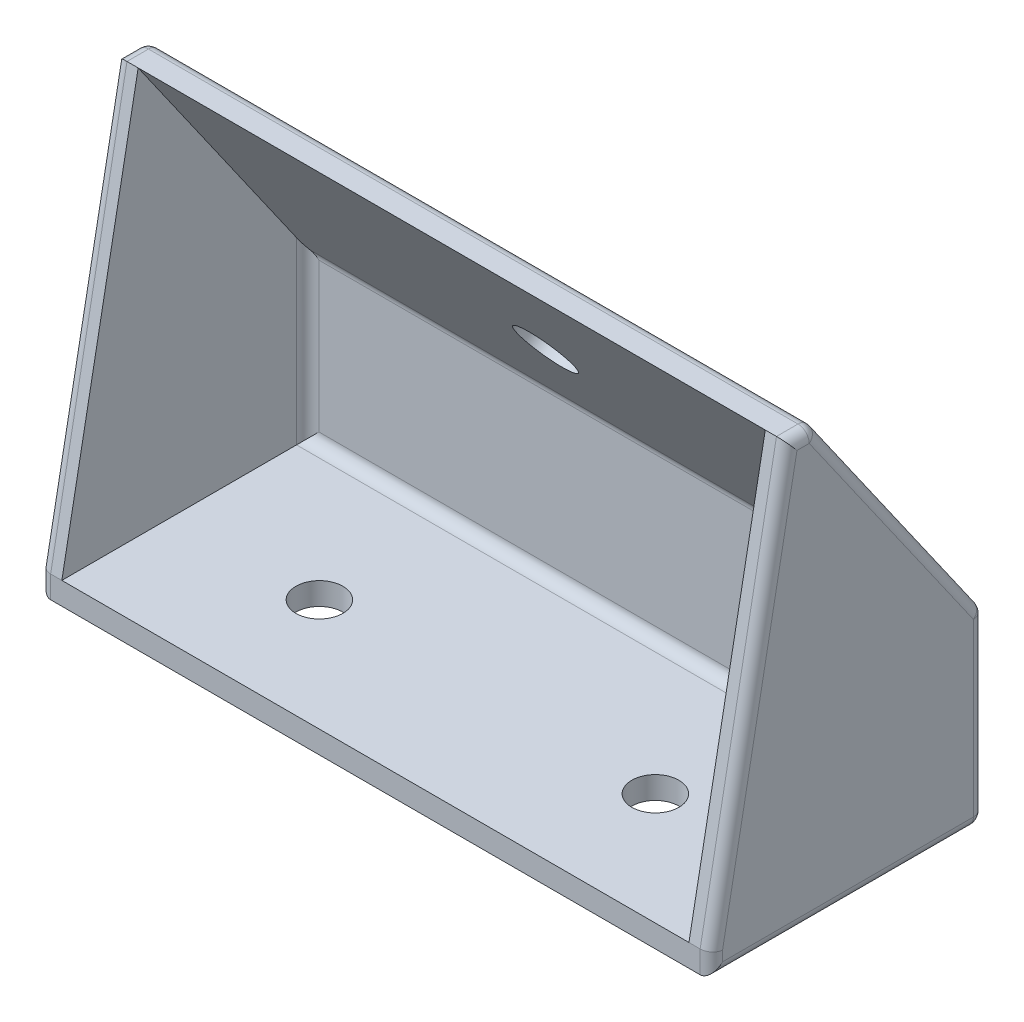
ISO-10303-21;
HEADER;
FILE_DESCRIPTION(('STEP AP214'),'2;1');
FILE_NAME('part.step','',(''),(''),'','','');
FILE_SCHEMA(('AUTOMOTIVE_DESIGN { 1 0 10303 214 1 1 1 1 }'));
ENDSEC;
DATA;
#1=APPLICATION_CONTEXT('core data for automotive mechanical design processes');
#2=APPLICATION_PROTOCOL_DEFINITION('international standard','automotive_design',2000,#1);
#3=PRODUCT_CONTEXT('',#1,'mechanical');
#4=PRODUCT('Part','Part','',(#3));
#5=PRODUCT_RELATED_PRODUCT_CATEGORY('part','',(#4));
#6=PRODUCT_DEFINITION_FORMATION('','',#4);
#7=PRODUCT_DEFINITION_CONTEXT('part definition',#1,'design');
#8=PRODUCT_DEFINITION('design','',#6,#7);
#9=PRODUCT_DEFINITION_SHAPE('','',#8);
#10=(LENGTH_UNIT() NAMED_UNIT(*) SI_UNIT(.MILLI.,.METRE.));
#11=(NAMED_UNIT(*) PLANE_ANGLE_UNIT() SI_UNIT($,.RADIAN.));
#12=(NAMED_UNIT(*) SI_UNIT($,.STERADIAN.) SOLID_ANGLE_UNIT());
#13=UNCERTAINTY_MEASURE_WITH_UNIT(LENGTH_MEASURE(1.E-05),#10,'distance_accuracy_value','');
#14=(GEOMETRIC_REPRESENTATION_CONTEXT(3) GLOBAL_UNCERTAINTY_ASSIGNED_CONTEXT((#13)) GLOBAL_UNIT_ASSIGNED_CONTEXT((#10,
#11,#12)) REPRESENTATION_CONTEXT('',''));
#15=CARTESIAN_POINT('',(0.,0.,0.));
#16=DIRECTION('',(0.,0.,1.));
#17=DIRECTION('',(1.,0.,0.));
#18=AXIS2_PLACEMENT_3D('',#15,#16,#17);
#19=CARTESIAN_POINT('',(-38.1,0.,-30.4272325445459));
#20=DIRECTION('',(0.,0.573576436351044,-0.819152044288993));
#21=DIRECTION('',(0.,0.819152044288993,0.573576436351044));
#22=AXIS2_PLACEMENT_3D('',#19,#20,#21);
#23=PLANE('',#22);
#24=CARTESIAN_POINT('',(0.,12.2753807221291,-21.831918428517));
#25=DIRECTION('',(0.,0.573576436351044,-0.819152044288993));
#26=DIRECTION('',(0.,0.819152044288993,0.573576436351044));
#27=AXIS2_PLACEMENT_3D('',#24,#25,#26);
#28=CIRCLE('',#27,3.25);
#29=CARTESIAN_POINT('',(0.,14.9376248660683,-19.9677950103761));
#30=VERTEX_POINT('',#29);
#31=EDGE_CURVE('E240',#30,#30,#28,.F.);
#32=ORIENTED_EDGE('',*,*,#31,.F.);
#33=EDGE_LOOP('',(#32));
#34=FACE_BOUND('',#33,.T.);
#35=DIRECTION('',(1.,0.,0.));
#36=VECTOR('',#35,1.);
#37=CARTESIAN_POINT('',(35.56,0.32801261228952,-30.1975556407929));
#38=LINE('',#37,#36);
#39=CARTESIAN_POINT('',(-35.0184420741664,0.32801261228952,-30.1975556407929));
#40=VERTEX_POINT('',#39);
#41=CARTESIAN_POINT('',(35.0184420741664,0.32801261228952,-30.1975556407929));
#42=VERTEX_POINT('',#41);
#43=EDGE_CURVE('E265',#40,#42,#38,.T.);
#44=ORIENTED_EDGE('',*,*,#43,.T.);
#45=CARTESIAN_POINT('',(34.29,1.8137479685625,-29.1572325445459));
#46=DIRECTION('',(0.,0.573576436351044,-0.819152044288993));
#47=DIRECTION('',(0.,-0.819152044288993,-0.573576436351044));
#48=AXIS2_PLACEMENT_3D('',#45,#46,#47);
#49=ELLIPSE('',#48,2.2141774304388,1.27);
#50=CARTESIAN_POINT('',(35.56,1.81374796856249,-29.1572325445459));
#51=VERTEX_POINT('',#50);
#52=EDGE_CURVE('E269',#42,#51,#49,.F.);
#53=ORIENTED_EDGE('',*,*,#52,.T.);
#54=DIRECTION('',(0.,0.819152044288993,0.573576436351044));
#55=VECTOR('',#54,1.);
#56=CARTESIAN_POINT('',(35.56,0.,-30.4272325445459));
#57=LINE('',#56,#55);
#58=CARTESIAN_POINT('',(35.56,27.4645297409215,-11.196361786568));
#59=VERTEX_POINT('',#58);
#60=EDGE_CURVE('E231',#51,#59,#57,.T.);
#61=ORIENTED_EDGE('',*,*,#60,.T.);
#62=DIRECTION('',(1.,0.,0.));
#63=VECTOR('',#62,1.);
#64=CARTESIAN_POINT('',(38.1,27.4645297409215,-11.196361786568));
#65=LINE('',#64,#63);
#66=CARTESIAN_POINT('',(-35.56,27.4645297409215,-11.196361786568));
#67=VERTEX_POINT('',#66);
#68=EDGE_CURVE('E195',#67,#59,#65,.T.);
#69=ORIENTED_EDGE('',*,*,#68,.F.);
#70=DIRECTION('',(0.,-0.819152044288993,-0.573576436351044));
#71=VECTOR('',#70,1.);
#72=CARTESIAN_POINT('',(-35.56,27.4645297409215,-11.196361786568));
#73=LINE('',#72,#71);
#74=CARTESIAN_POINT('',(-35.56,1.81374796856248,-29.1572325445459));
#75=VERTEX_POINT('',#74);
#76=EDGE_CURVE('E209',#67,#75,#73,.T.);
#77=ORIENTED_EDGE('',*,*,#76,.T.);
#78=CARTESIAN_POINT('',(-34.29,1.8137479685625,-29.1572325445459));
#79=DIRECTION('',(0.,0.573576436351044,-0.819152044288993));
#80=DIRECTION('',(0.,-0.819152044288993,-0.573576436351044));
#81=AXIS2_PLACEMENT_3D('',#78,#79,#80);
#82=ELLIPSE('',#81,2.2141774304388,1.27);
#83=EDGE_CURVE('E267',#75,#40,#82,.F.);
#84=ORIENTED_EDGE('',*,*,#83,.T.);
#85=EDGE_LOOP('',(#44,#53,#61,#69,#77,#84));
#86=FACE_BOUND('',#85,.T.);
#87=ADVANCED_FACE('F34',(#34,#86),#23,.F.);
#88=CARTESIAN_POINT('',(-38.1,-18.542,-30.4272325445459));
#89=DIRECTION('',(0.,0.,-1.));
#90=DIRECTION('',(-1.,0.,0.));
#91=AXIS2_PLACEMENT_3D('',#88,#89,#90);
#92=PLANE('',#91);
#93=DIRECTION('',(1.,0.,0.));
#94=VECTOR('',#93,1.);
#95=CARTESIAN_POINT('',(35.56,-17.272,-30.4272325445459));
#96=LINE('',#95,#94);
#97=CARTESIAN_POINT('',(-34.29,-17.272,-30.4272325445459));
#98=VERTEX_POINT('',#97);
#99=CARTESIAN_POINT('',(34.29,-17.272,-30.4272325445459));
#100=VERTEX_POINT('',#99);
#101=EDGE_CURVE('E260',#98,#100,#96,.T.);
#102=ORIENTED_EDGE('',*,*,#101,.T.);
#103=DIRECTION('',(0.,1.,0.));
#104=VECTOR('',#103,1.);
#105=CARTESIAN_POINT('',(34.29,0.,-30.4272325445459));
#106=LINE('',#105,#104);
#107=CARTESIAN_POINT('',(34.29,-0.400429461876306,-30.4272325445459));
#108=VERTEX_POINT('',#107);
#109=EDGE_CURVE('E262',#100,#108,#106,.T.);
#110=ORIENTED_EDGE('',*,*,#109,.T.);
#111=DIRECTION('',(1.,0.,0.));
#112=VECTOR('',#111,1.);
#113=CARTESIAN_POINT('',(-35.56,-0.400429461876306,-30.4272325445459));
#114=LINE('',#113,#112);
#115=CARTESIAN_POINT('',(-34.29,-0.400429461876306,-30.4272325445459));
#116=VERTEX_POINT('',#115);
#117=EDGE_CURVE('E256',#108,#116,#114,.F.);
#118=ORIENTED_EDGE('',*,*,#117,.T.);
#119=DIRECTION('',(0.,-1.,0.));
#120=VECTOR('',#119,1.);
#121=CARTESIAN_POINT('',(-34.29,-18.542,-30.4272325445459));
#122=LINE('',#121,#120);
#123=EDGE_CURVE('E258',#116,#98,#122,.T.);
#124=ORIENTED_EDGE('',*,*,#123,.T.);
#125=EDGE_LOOP('',(#102,#110,#118,#124));
#126=FACE_BOUND('',#125,.T.);
#127=ADVANCED_FACE('F519',(#126),#92,.F.);
#128=CARTESIAN_POINT('',(-38.1,-18.542,-2.54));
#129=DIRECTION('',(0.,-1.,0.));
#130=DIRECTION('',(0.,0.,-1.));
#131=AXIS2_PLACEMENT_3D('',#128,#129,#130);
#132=PLANE('',#131);
#133=CARTESIAN_POINT('',(19.05,-18.542,-15.24));
#134=DIRECTION('',(0.,1.,0.));
#135=DIRECTION('',(0.,0.,1.));
#136=AXIS2_PLACEMENT_3D('',#133,#134,#135);
#137=CIRCLE('',#136,2.667);
#138=CARTESIAN_POINT('',(19.05,-18.542,-12.573));
#139=VERTEX_POINT('',#138);
#140=EDGE_CURVE('E247',#139,#139,#137,.T.);
#141=ORIENTED_EDGE('',*,*,#140,.F.);
#142=EDGE_LOOP('',(#141));
#143=FACE_BOUND('',#142,.T.);
#144=CARTESIAN_POINT('',(-19.05,-18.542,-15.24));
#145=DIRECTION('',(0.,1.,0.));
#146=DIRECTION('',(0.,0.,1.));
#147=AXIS2_PLACEMENT_3D('',#144,#145,#146);
#148=CIRCLE('',#147,2.667);
#149=CARTESIAN_POINT('',(-19.05,-18.542,-12.573));
#150=VERTEX_POINT('',#149);
#151=EDGE_CURVE('E243',#150,#150,#148,.T.);
#152=ORIENTED_EDGE('',*,*,#151,.F.);
#153=EDGE_LOOP('',(#152));
#154=FACE_BOUND('',#153,.T.);
#155=DIRECTION('',(0.,0.,-1.));
#156=VECTOR('',#155,1.);
#157=CARTESIAN_POINT('',(35.56,-18.542,-2.54));
#158=LINE('',#157,#156);
#159=CARTESIAN_POINT('',(35.56,-18.542,-2.54));
#160=VERTEX_POINT('',#159);
#161=CARTESIAN_POINT('',(35.56,-18.542,-29.1572325445459));
#162=VERTEX_POINT('',#161);
#163=EDGE_CURVE('E229',#160,#162,#158,.T.);
#164=ORIENTED_EDGE('',*,*,#163,.T.);
#165=DIRECTION('',(1.,0.,0.));
#166=VECTOR('',#165,1.);
#167=CARTESIAN_POINT('',(-35.56,-18.542,-29.1572325445459));
#168=LINE('',#167,#166);
#169=CARTESIAN_POINT('',(-35.56,-18.542,-29.1572325445459));
#170=VERTEX_POINT('',#169);
#171=EDGE_CURVE('E205',#162,#170,#168,.F.);
#172=ORIENTED_EDGE('',*,*,#171,.T.);
#173=DIRECTION('',(0.,0.,1.));
#174=VECTOR('',#173,1.);
#175=CARTESIAN_POINT('',(-35.56,-18.542,-30.4272325445459));
#176=LINE('',#175,#174);
#177=CARTESIAN_POINT('',(-35.56,-18.542,-2.54));
#178=VERTEX_POINT('',#177);
#179=EDGE_CURVE('E200',#170,#178,#176,.T.);
#180=ORIENTED_EDGE('',*,*,#179,.T.);
#181=DIRECTION('',(1.,0.,0.));
#182=VECTOR('',#181,1.);
#183=CARTESIAN_POINT('',(-38.1,-18.542,-2.54));
#184=LINE('',#183,#182);
#185=EDGE_CURVE('E196',#178,#160,#184,.T.);
#186=ORIENTED_EDGE('',*,*,#185,.T.);
#187=EDGE_LOOP('',(#164,#172,#180,#186));
#188=FACE_BOUND('',#187,.T.);
#189=ADVANCED_FACE('F202',(#143,#154,#188),#132,.F.);
#190=CARTESIAN_POINT('',(38.1,0.,0.));
#191=DIRECTION('',(1.,0.,0.));
#192=DIRECTION('',(0.,0.,-1.));
#193=AXIS2_PLACEMENT_3D('',#190,#191,#192);
#194=PLANE('',#193);
#195=DIRECTION('',(0.,-1.,0.));
#196=VECTOR('',#195,1.);
#197=CARTESIAN_POINT('',(38.1,0.,-3.81));
#198=LINE('',#197,#196);
#199=CARTESIAN_POINT('',(38.1,-18.6604393288876,-3.81));
#200=VERTEX_POINT('',#199);
#201=CARTESIAN_POINT('',(38.1,-19.812,-3.81));
#202=VERTEX_POINT('',#201);
#203=EDGE_CURVE('E292',#200,#202,#198,.T.);
#204=ORIENTED_EDGE('',*,*,#203,.T.);
#205=DIRECTION('',(0.,0.,1.));
#206=VECTOR('',#205,1.);
#207=CARTESIAN_POINT('',(38.1,-19.812,0.));
#208=LINE('',#207,#206);
#209=CARTESIAN_POINT('',(38.1,-19.812,-32.258));
#210=VERTEX_POINT('',#209);
#211=EDGE_CURVE('E294',#202,#210,#208,.F.);
#212=ORIENTED_EDGE('',*,*,#211,.T.);
#213=DIRECTION('',(0.,1.,0.));
#214=VECTOR('',#213,1.);
#215=CARTESIAN_POINT('',(38.1,0.,-32.258));
#216=LINE('',#215,#214);
#217=CARTESIAN_POINT('',(38.1,-0.400429461876302,-32.258));
#218=VERTEX_POINT('',#217);
#219=EDGE_CURVE('E286',#210,#218,#216,.T.);
#220=ORIENTED_EDGE('',*,*,#219,.T.);
#221=DIRECTION('',(0.,0.819152044288993,0.573576436351044));
#222=VECTOR('',#221,1.);
#223=CARTESIAN_POINT('',(38.1,26.7360876667557,-13.2568061457751));
#224=LINE('',#223,#222);
#225=CARTESIAN_POINT('',(38.1,26.1945297409215,-13.6360090878214));
#226=VERTEX_POINT('',#225);
#227=EDGE_CURVE('E284',#218,#226,#224,.T.);
#228=ORIENTED_EDGE('',*,*,#227,.T.);
#229=DIRECTION('',(0.,0.,1.));
#230=VECTOR('',#229,1.);
#231=CARTESIAN_POINT('',(38.1,26.1945297409215,-11.196361786568));
#232=LINE('',#231,#230);
#233=CARTESIAN_POINT('',(38.1,26.1945297409215,-12.249689808819));
#234=VERTEX_POINT('',#233);
#235=EDGE_CURVE('E288',#226,#234,#232,.T.);
#236=ORIENTED_EDGE('',*,*,#235,.T.);
#237=DIRECTION('',(0.,-0.982755382280779,0.184910406949311));
#238=VECTOR('',#237,1.);
#239=CARTESIAN_POINT('',(38.1,-1.33039477103238,-7.07073573283892));
#240=LINE('',#239,#238);
#241=EDGE_CURVE('E290',#234,#200,#240,.T.);
#242=ORIENTED_EDGE('',*,*,#241,.T.);
#243=EDGE_LOOP('',(#204,#212,#220,#228,#236,#242));
#244=FACE_BOUND('',#243,.T.);
#245=ADVANCED_FACE('F615',(#244),#194,.T.);
#246=CARTESIAN_POINT('',(-38.1,0.,0.));
#247=DIRECTION('',(1.,0.,0.));
#248=DIRECTION('',(0.,0.,-1.));
#249=AXIS2_PLACEMENT_3D('',#246,#247,#248);
#250=PLANE('',#249);
#251=DIRECTION('',(0.,-1.,0.));
#252=VECTOR('',#251,1.);
#253=CARTESIAN_POINT('',(-38.1,-18.542,-3.81));
#254=LINE('',#253,#252);
#255=CARTESIAN_POINT('',(-38.1,-19.812,-3.81));
#256=VERTEX_POINT('',#255);
#257=CARTESIAN_POINT('',(-38.1,-18.6604393288876,-3.81));
#258=VERTEX_POINT('',#257);
#259=EDGE_CURVE('E327',#256,#258,#254,.F.);
#260=ORIENTED_EDGE('',*,*,#259,.T.);
#261=DIRECTION('',(0.,0.982755382280779,-0.184910406949311));
#262=VECTOR('',#261,1.);
#263=CARTESIAN_POINT('',(-38.1,27.2296935240959,-12.4444611220646));
#264=LINE('',#263,#262);
#265=CARTESIAN_POINT('',(-38.1,26.1945297409215,-12.249689808819));
#266=VERTEX_POINT('',#265);
#267=EDGE_CURVE('E329',#258,#266,#264,.T.);
#268=ORIENTED_EDGE('',*,*,#267,.T.);
#269=DIRECTION('',(0.,0.,1.));
#270=VECTOR('',#269,1.);
#271=CARTESIAN_POINT('',(-38.1,26.1945297409215,0.));
#272=LINE('',#271,#270);
#273=CARTESIAN_POINT('',(-38.1,26.1945297409215,-13.6360090878214));
#274=VERTEX_POINT('',#273);
#275=EDGE_CURVE('E320',#266,#274,#272,.F.);
#276=ORIENTED_EDGE('',*,*,#275,.T.);
#277=DIRECTION('',(0.,0.819152044288993,0.573576436351044));
#278=VECTOR('',#277,1.);
#279=CARTESIAN_POINT('',(-38.1,15.0245650206891,-21.4573025864646));
#280=LINE('',#279,#278);
#281=CARTESIAN_POINT('',(-38.1,-0.400429461876311,-32.258));
#282=VERTEX_POINT('',#281);
#283=EDGE_CURVE('E318',#274,#282,#280,.F.);
#284=ORIENTED_EDGE('',*,*,#283,.T.);
#285=DIRECTION('',(0.,1.,0.));
#286=VECTOR('',#285,1.);
#287=CARTESIAN_POINT('',(-38.1,0.,-32.258));
#288=LINE('',#287,#286);
#289=CARTESIAN_POINT('',(-38.1,-19.812,-32.258));
#290=VERTEX_POINT('',#289);
#291=EDGE_CURVE('E322',#282,#290,#288,.F.);
#292=ORIENTED_EDGE('',*,*,#291,.T.);
#293=DIRECTION('',(0.,0.,-1.));
#294=VECTOR('',#293,1.);
#295=CARTESIAN_POINT('',(-38.1,-19.812,-2.54));
#296=LINE('',#295,#294);
#297=EDGE_CURVE('E324',#290,#256,#296,.F.);
#298=ORIENTED_EDGE('',*,*,#297,.T.);
#299=EDGE_LOOP('',(#260,#268,#276,#284,#292,#298));
#300=FACE_BOUND('',#299,.T.);
#301=ADVANCED_FACE('F422',(#300),#250,.F.);
#302=CARTESIAN_POINT('',(0.,-21.082,0.));
#303=DIRECTION('',(0.,-1.,0.));
#304=DIRECTION('',(0.,0.,-1.));
#305=AXIS2_PLACEMENT_3D('',#302,#303,#304);
#306=PLANE('',#305);
#307=CARTESIAN_POINT('',(-19.05,-21.082,-15.24));
#308=DIRECTION('',(0.,1.,0.));
#309=DIRECTION('',(0.,0.,1.));
#310=AXIS2_PLACEMENT_3D('',#307,#308,#309);
#311=CIRCLE('',#310,2.667);
#312=CARTESIAN_POINT('',(-19.05,-21.082,-12.573));
#313=VERTEX_POINT('',#312);
#314=EDGE_CURVE('E244',#313,#313,#311,.T.);
#315=ORIENTED_EDGE('',*,*,#314,.T.);
#316=EDGE_LOOP('',(#315));
#317=FACE_BOUND('',#316,.T.);
#318=CARTESIAN_POINT('',(19.05,-21.082,-15.24));
#319=DIRECTION('',(0.,1.,0.));
#320=DIRECTION('',(0.,0.,1.));
#321=AXIS2_PLACEMENT_3D('',#318,#319,#320);
#322=CIRCLE('',#321,2.667);
#323=CARTESIAN_POINT('',(19.05,-21.082,-12.573));
#324=VERTEX_POINT('',#323);
#325=EDGE_CURVE('E216',#324,#324,#322,.T.);
#326=ORIENTED_EDGE('',*,*,#325,.T.);
#327=EDGE_LOOP('',(#326));
#328=FACE_BOUND('',#327,.T.);
#329=DIRECTION('',(1.,0.,0.));
#330=VECTOR('',#329,1.);
#331=CARTESIAN_POINT('',(38.1,-21.082,-32.258));
#332=LINE('',#331,#330);
#333=CARTESIAN_POINT('',(-36.83,-21.082,-32.258));
#334=VERTEX_POINT('',#333);
#335=CARTESIAN_POINT('',(36.83,-21.082,-32.258));
#336=VERTEX_POINT('',#335);
#337=EDGE_CURVE('E279',#334,#336,#332,.T.);
#338=ORIENTED_EDGE('',*,*,#337,.T.);
#339=DIRECTION('',(0.,0.,1.));
#340=VECTOR('',#339,1.);
#341=CARTESIAN_POINT('',(36.83,-21.082,0.));
#342=LINE('',#341,#340);
#343=CARTESIAN_POINT('',(36.83,-21.082,-2.54));
#344=VERTEX_POINT('',#343);
#345=EDGE_CURVE('E281',#336,#344,#342,.T.);
#346=ORIENTED_EDGE('',*,*,#345,.T.);
#347=DIRECTION('',(-1.,0.,0.));
#348=VECTOR('',#347,1.);
#349=CARTESIAN_POINT('',(0.,-21.082,-2.54));
#350=LINE('',#349,#348);
#351=CARTESIAN_POINT('',(-36.83,-21.082,-2.54));
#352=VERTEX_POINT('',#351);
#353=EDGE_CURVE('E236',#344,#352,#350,.T.);
#354=ORIENTED_EDGE('',*,*,#353,.T.);
#355=DIRECTION('',(0.,0.,-1.));
#356=VECTOR('',#355,1.);
#357=CARTESIAN_POINT('',(-36.83,-21.082,-33.528));
#358=LINE('',#357,#356);
#359=EDGE_CURVE('E277',#352,#334,#358,.T.);
#360=ORIENTED_EDGE('',*,*,#359,.T.);
#361=EDGE_LOOP('',(#338,#346,#354,#360));
#362=FACE_BOUND('',#361,.T.);
#363=ADVANCED_FACE('F450',(#317,#328,#362),#306,.T.);
#364=CARTESIAN_POINT('',(38.1,27.4645297409215,-14.2971292420221));
#365=DIRECTION('',(0.,-1.,0.));
#366=DIRECTION('',(0.,0.,-1.));
#367=AXIS2_PLACEMENT_3D('',#364,#365,#366);
#368=PLANE('',#367);
#369=DIRECTION('',(1.,0.,0.));
#370=VECTOR('',#369,1.);
#371=CARTESIAN_POINT('',(35.56,27.4645297409215,-11.196361786568));
#372=LINE('',#371,#370);
#373=CARTESIAN_POINT('',(36.83,27.4645297409215,-11.196361786568));
#374=VERTEX_POINT('',#373);
#375=EDGE_CURVE('E233',#59,#374,#372,.T.);
#376=ORIENTED_EDGE('',*,*,#375,.T.);
#377=DIRECTION('',(0.,0.,1.));
#378=VECTOR('',#377,1.);
#379=CARTESIAN_POINT('',(36.83,27.4645297409215,-14.2971292420221));
#380=LINE('',#379,#378);
#381=CARTESIAN_POINT('',(36.83,27.4645297409215,-13.6360090878214));
#382=VERTEX_POINT('',#381);
#383=EDGE_CURVE('E307',#374,#382,#380,.F.);
#384=ORIENTED_EDGE('',*,*,#383,.T.);
#385=DIRECTION('',(-1.,0.,0.));
#386=VECTOR('',#385,1.);
#387=CARTESIAN_POINT('',(38.1,27.4645297409215,-13.6360090878214));
#388=LINE('',#387,#386);
#389=CARTESIAN_POINT('',(-36.83,27.4645297409215,-13.6360090878214));
#390=VERTEX_POINT('',#389);
#391=EDGE_CURVE('E303',#382,#390,#388,.T.);
#392=ORIENTED_EDGE('',*,*,#391,.T.);
#393=DIRECTION('',(0.,0.,1.));
#394=VECTOR('',#393,1.);
#395=CARTESIAN_POINT('',(-36.83,27.4645297409215,-14.2971292420221));
#396=LINE('',#395,#394);
#397=CARTESIAN_POINT('',(-36.83,27.4645297409215,-11.196361786568));
#398=VERTEX_POINT('',#397);
#399=EDGE_CURVE('E305',#390,#398,#396,.T.);
#400=ORIENTED_EDGE('',*,*,#399,.T.);
#401=EDGE_CURVE('E254',#398,#67,#65,.T.);
#402=ORIENTED_EDGE('',*,*,#401,.T.);
#403=ORIENTED_EDGE('',*,*,#68,.T.);
#404=EDGE_LOOP('',(#376,#384,#392,#400,#402,#403));
#405=FACE_BOUND('',#404,.T.);
#406=ADVANCED_FACE('F480',(#405),#368,.F.);
#407=CARTESIAN_POINT('',(38.1,27.4645297409215,-14.2971292420221));
#408=DIRECTION('',(0.,-0.573576436351044,0.819152044288993));
#409=DIRECTION('',(0.,-0.819152044288993,-0.573576436351044));
#410=AXIS2_PLACEMENT_3D('',#407,#408,#409);
#411=PLANE('',#410);
#412=DIRECTION('',(0.,0.819152044288993,0.573576436351044));
#413=VECTOR('',#412,1.);
#414=CARTESIAN_POINT('',(36.83,0.,-33.528));
#415=LINE('',#414,#413);
#416=CARTESIAN_POINT('',(36.83,26.9229718150873,-14.6763321840684));
#417=VERTEX_POINT('',#416);
#418=CARTESIAN_POINT('',(36.83,0.328012612289519,-33.298323096247));
#419=VERTEX_POINT('',#418);
#420=EDGE_CURVE('E51',#417,#419,#415,.F.);
#421=ORIENTED_EDGE('',*,*,#420,.T.);
#422=DIRECTION('',(-1.,0.,0.));
#423=VECTOR('',#422,1.);
#424=CARTESIAN_POINT('',(38.1,0.328012612289517,-33.298323096247));
#425=LINE('',#424,#423);
#426=CARTESIAN_POINT('',(-36.83,0.328012612289519,-33.298323096247));
#427=VERTEX_POINT('',#426);
#428=EDGE_CURVE('E43',#419,#427,#425,.T.);
#429=ORIENTED_EDGE('',*,*,#428,.T.);
#430=DIRECTION('',(0.,0.819152044288993,0.573576436351044));
#431=VECTOR('',#430,1.);
#432=CARTESIAN_POINT('',(-36.83,27.4645297409215,-14.2971292420221));
#433=LINE('',#432,#431);
#434=CARTESIAN_POINT('',(-36.83,26.9229718150873,-14.6763321840684));
#435=VERTEX_POINT('',#434);
#436=EDGE_CURVE('E335',#427,#435,#433,.T.);
#437=ORIENTED_EDGE('',*,*,#436,.T.);
#438=DIRECTION('',(-1.,0.,0.));
#439=VECTOR('',#438,1.);
#440=CARTESIAN_POINT('',(38.1,26.9229718150873,-14.6763321840684));
#441=LINE('',#440,#439);
#442=EDGE_CURVE('E56',#435,#417,#441,.F.);
#443=ORIENTED_EDGE('',*,*,#442,.T.);
#444=EDGE_LOOP('',(#421,#429,#437,#443));
#445=FACE_BOUND('',#444,.T.);
#446=CARTESIAN_POINT('',(0.,13.7322648704607,-23.9125646210111));
#447=DIRECTION('',(0.,-0.573576436351044,0.819152044288993));
#448=DIRECTION('',(0.,-0.819152044288993,-0.573576436351044));
#449=AXIS2_PLACEMENT_3D('',#446,#447,#448);
#450=CIRCLE('',#449,4.52);
#451=CARTESIAN_POINT('',(0.,10.0296976302745,-26.5051301133178));
#452=VERTEX_POINT('',#451);
#453=EDGE_CURVE('E332',#452,#452,#450,.T.);
#454=ORIENTED_EDGE('',*,*,#453,.T.);
#455=EDGE_LOOP('',(#454));
#456=FACE_BOUND('',#455,.T.);
#457=ADVANCED_FACE('F499',(#445,#456),#411,.F.);
#458=CARTESIAN_POINT('',(38.1,-21.082,-33.528));
#459=DIRECTION('',(0.,0.,1.));
#460=DIRECTION('',(1.,0.,0.));
#461=AXIS2_PLACEMENT_3D('',#458,#459,#460);
#462=PLANE('',#461);
#463=DIRECTION('',(0.,1.,0.));
#464=VECTOR('',#463,1.);
#465=CARTESIAN_POINT('',(36.83,-21.082,-33.528));
#466=LINE('',#465,#464);
#467=CARTESIAN_POINT('',(36.83,-0.400429461876309,-33.528));
#468=VERTEX_POINT('',#467);
#469=CARTESIAN_POINT('',(36.83,-19.812,-33.528));
#470=VERTEX_POINT('',#469);
#471=EDGE_CURVE('E313',#468,#470,#466,.F.);
#472=ORIENTED_EDGE('',*,*,#471,.T.);
#473=DIRECTION('',(1.,0.,0.));
#474=VECTOR('',#473,1.);
#475=CARTESIAN_POINT('',(-38.1,-19.812,-33.528));
#476=LINE('',#475,#474);
#477=CARTESIAN_POINT('',(-36.83,-19.812,-33.528));
#478=VERTEX_POINT('',#477);
#479=EDGE_CURVE('E315',#470,#478,#476,.F.);
#480=ORIENTED_EDGE('',*,*,#479,.T.);
#481=DIRECTION('',(0.,1.,0.));
#482=VECTOR('',#481,1.);
#483=CARTESIAN_POINT('',(-36.83,-21.082,-33.528));
#484=LINE('',#483,#482);
#485=CARTESIAN_POINT('',(-36.83,-0.400429461876309,-33.528));
#486=VERTEX_POINT('',#485);
#487=EDGE_CURVE('E311',#478,#486,#484,.T.);
#488=ORIENTED_EDGE('',*,*,#487,.T.);
#489=DIRECTION('',(-1.,0.,0.));
#490=VECTOR('',#489,1.);
#491=CARTESIAN_POINT('',(38.1,-0.400429461876309,-33.528));
#492=LINE('',#491,#490);
#493=EDGE_CURVE('E309',#486,#468,#492,.F.);
#494=ORIENTED_EDGE('',*,*,#493,.T.);
#495=EDGE_LOOP('',(#472,#480,#488,#494));
#496=FACE_BOUND('',#495,.T.);
#497=ADVANCED_FACE('F502',(#496),#462,.F.);
#498=CARTESIAN_POINT('',(19.05,-21.082,-15.24));
#499=DIRECTION('',(0.,1.,0.));
#500=DIRECTION('',(0.,0.,1.));
#501=AXIS2_PLACEMENT_3D('',#498,#499,#500);
#502=CYLINDRICAL_SURFACE('',#501,2.667);
#503=ORIENTED_EDGE('',*,*,#325,.F.);
#504=EDGE_LOOP('',(#503));
#505=FACE_BOUND('',#504,.T.);
#506=ORIENTED_EDGE('',*,*,#140,.T.);
#507=EDGE_LOOP('',(#506));
#508=FACE_BOUND('',#507,.T.);
#509=ADVANCED_FACE('F621',(#505,#508),#502,.F.);
#510=CARTESIAN_POINT('',(-19.05,-21.082,-15.24));
#511=DIRECTION('',(0.,1.,0.));
#512=DIRECTION('',(0.,0.,1.));
#513=AXIS2_PLACEMENT_3D('',#510,#511,#512);
#514=CYLINDRICAL_SURFACE('',#513,2.667);
#515=ORIENTED_EDGE('',*,*,#314,.F.);
#516=EDGE_LOOP('',(#515));
#517=FACE_BOUND('',#516,.T.);
#518=ORIENTED_EDGE('',*,*,#151,.T.);
#519=EDGE_LOOP('',(#518));
#520=FACE_BOUND('',#519,.T.);
#521=ADVANCED_FACE('F513',(#517,#520),#514,.F.);
#522=CARTESIAN_POINT('',(0.,7.0028434823848,-14.3019548791026));
#523=DIRECTION('',(0.,0.573576436351044,-0.819152044288993));
#524=DIRECTION('',(0.,0.819152044288993,0.573576436351044));
#525=AXIS2_PLACEMENT_3D('',#522,#523,#524);
#526=CYLINDRICAL_SURFACE('',#525,3.25);
#527=CARTESIAN_POINT('',(0.,13.0038227962949,-22.872241524764));
#528=DIRECTION('',(0.,-0.573576436351044,0.819152044288993));
#529=DIRECTION('',(0.,-0.819152044288993,-0.573576436351044));
#530=AXIS2_PLACEMENT_3D('',#527,#528,#529);
#531=CIRCLE('',#530,3.25);
#532=CARTESIAN_POINT('',(0.,10.3415786523557,-24.7363649429049));
#533=VERTEX_POINT('',#532);
#534=EDGE_CURVE('E11',#533,#533,#531,.F.);
#535=ORIENTED_EDGE('',*,*,#534,.T.);
#536=EDGE_LOOP('',(#535));
#537=FACE_BOUND('',#536,.T.);
#538=ORIENTED_EDGE('',*,*,#31,.T.);
#539=EDGE_LOOP('',(#538));
#540=FACE_BOUND('',#539,.T.);
#541=ADVANCED_FACE('F510',(#537,#540),#526,.F.);
#542=CARTESIAN_POINT('',(-38.1,39.8270955720472,-2.54));
#543=DIRECTION('',(0.,0.,1.));
#544=DIRECTION('',(0.,-1.,0.));
#545=AXIS2_PLACEMENT_3D('',#542,#543,#544);
#546=PLANE('',#545);
#547=ORIENTED_EDGE('',*,*,#353,.F.);
#548=DIRECTION('',(0.,-1.,0.));
#549=VECTOR('',#548,1.);
#550=CARTESIAN_POINT('',(36.83,39.8270955720472,-2.54));
#551=LINE('',#550,#549);
#552=CARTESIAN_POINT('',(36.83,-18.542,-2.54));
#553=VERTEX_POINT('',#552);
#554=EDGE_CURVE('E299',#344,#553,#551,.F.);
#555=ORIENTED_EDGE('',*,*,#554,.T.);
#556=DIRECTION('',(1.,0.,0.));
#557=VECTOR('',#556,1.);
#558=CARTESIAN_POINT('',(35.56,-18.542,-2.54));
#559=LINE('',#558,#557);
#560=EDGE_CURVE('E214',#160,#553,#559,.T.);
#561=ORIENTED_EDGE('',*,*,#560,.F.);
#562=ORIENTED_EDGE('',*,*,#185,.F.);
#563=CARTESIAN_POINT('',(-36.83,-18.542,-2.54));
#564=VERTEX_POINT('',#563);
#565=EDGE_CURVE('E184',#564,#178,#184,.T.);
#566=ORIENTED_EDGE('',*,*,#565,.F.);
#567=DIRECTION('',(0.,-1.,0.));
#568=VECTOR('',#567,1.);
#569=CARTESIAN_POINT('',(-36.83,-21.082,-2.54));
#570=LINE('',#569,#568);
#571=EDGE_CURVE('E297',#564,#352,#570,.T.);
#572=ORIENTED_EDGE('',*,*,#571,.T.);
#573=EDGE_LOOP('',(#547,#555,#561,#562,#566,#572));
#574=FACE_BOUND('',#573,.T.);
#575=ADVANCED_FACE('F212',(#574),#546,.T.);
#576=CARTESIAN_POINT('',(35.56,27.4645297409215,-11.196361786568));
#577=DIRECTION('',(0.,0.184910406949311,0.982755382280779));
#578=DIRECTION('',(0.,-0.982755382280779,0.184910406949311));
#579=AXIS2_PLACEMENT_3D('',#576,#577,#578);
#580=PLANE('',#579);
#581=ORIENTED_EDGE('',*,*,#560,.T.);
#582=DIRECTION('',(0.,-0.982755382280779,0.184910406949311));
#583=VECTOR('',#582,1.);
#584=CARTESIAN_POINT('',(36.83,27.4645297409215,-11.196361786568));
#585=LINE('',#584,#583);
#586=EDGE_CURVE('E301',#553,#374,#585,.F.);
#587=ORIENTED_EDGE('',*,*,#586,.T.);
#588=ORIENTED_EDGE('',*,*,#375,.F.);
#589=DIRECTION('',(0.,-0.982755382280779,0.184910406949311));
#590=VECTOR('',#589,1.);
#591=CARTESIAN_POINT('',(35.56,27.4645297409215,-11.196361786568));
#592=LINE('',#591,#590);
#593=EDGE_CURVE('E208',#59,#160,#592,.T.);
#594=ORIENTED_EDGE('',*,*,#593,.T.);
#595=EDGE_LOOP('',(#581,#587,#588,#594));
#596=FACE_BOUND('',#595,.T.);
#597=ADVANCED_FACE('F466',(#596),#580,.T.);
#598=CARTESIAN_POINT('',(35.56,0.,0.));
#599=DIRECTION('',(1.,0.,0.));
#600=DIRECTION('',(0.,0.,-1.));
#601=AXIS2_PLACEMENT_3D('',#598,#599,#600);
#602=PLANE('',#601);
#603=ORIENTED_EDGE('',*,*,#60,.F.);
#604=DIRECTION('',(0.,1.,0.));
#605=VECTOR('',#604,1.);
#606=CARTESIAN_POINT('',(35.56,-18.542,-29.1572325445459));
#607=LINE('',#606,#605);
#608=EDGE_CURVE('E271',#51,#162,#607,.F.);
#609=ORIENTED_EDGE('',*,*,#608,.T.);
#610=ORIENTED_EDGE('',*,*,#163,.F.);
#611=ORIENTED_EDGE('',*,*,#593,.F.);
#612=EDGE_LOOP('',(#603,#609,#610,#611));
#613=FACE_BOUND('',#612,.T.);
#614=ADVANCED_FACE('F536',(#613),#602,.F.);
#615=CARTESIAN_POINT('',(-35.56,-18.542,-2.54));
#616=DIRECTION('',(0.,0.184910406949311,0.982755382280779));
#617=DIRECTION('',(0.,-0.982755382280779,0.184910406949311));
#618=AXIS2_PLACEMENT_3D('',#615,#616,#617);
#619=PLANE('',#618);
#620=ORIENTED_EDGE('',*,*,#401,.F.);
#621=DIRECTION('',(0.,0.982755382280779,-0.184910406949311));
#622=VECTOR('',#621,1.);
#623=CARTESIAN_POINT('',(-36.83,-18.542,-2.54));
#624=LINE('',#623,#622);
#625=EDGE_CURVE('E191',#398,#564,#624,.F.);
#626=ORIENTED_EDGE('',*,*,#625,.T.);
#627=ORIENTED_EDGE('',*,*,#565,.T.);
#628=DIRECTION('',(0.,0.982755382280779,-0.184910406949311));
#629=VECTOR('',#628,1.);
#630=CARTESIAN_POINT('',(-35.56,-18.542,-2.54));
#631=LINE('',#630,#629);
#632=EDGE_CURVE('E189',#178,#67,#631,.T.);
#633=ORIENTED_EDGE('',*,*,#632,.T.);
#634=EDGE_LOOP('',(#620,#626,#627,#633));
#635=FACE_BOUND('',#634,.T.);
#636=ADVANCED_FACE('F187',(#635),#619,.T.);
#637=CARTESIAN_POINT('',(-35.56,0.,0.));
#638=DIRECTION('',(1.,0.,0.));
#639=DIRECTION('',(0.,0.,-1.));
#640=AXIS2_PLACEMENT_3D('',#637,#638,#639);
#641=PLANE('',#640);
#642=ORIENTED_EDGE('',*,*,#179,.F.);
#643=DIRECTION('',(0.,-1.,0.));
#644=VECTOR('',#643,1.);
#645=CARTESIAN_POINT('',(-35.56,0.,-29.1572325445459));
#646=LINE('',#645,#644);
#647=EDGE_CURVE('E275',#170,#75,#646,.F.);
#648=ORIENTED_EDGE('',*,*,#647,.T.);
#649=ORIENTED_EDGE('',*,*,#76,.F.);
#650=ORIENTED_EDGE('',*,*,#632,.F.);
#651=EDGE_LOOP('',(#642,#648,#649,#650));
#652=FACE_BOUND('',#651,.T.);
#653=ADVANCED_FACE('F218',(#652),#641,.T.);
#654=CARTESIAN_POINT('',(-34.29,-18.542,-29.1572325445459));
#655=DIRECTION('',(0.,-1.,0.));
#656=DIRECTION('',(0.,0.,-1.));
#657=AXIS2_PLACEMENT_3D('',#654,#655,#656);
#658=CYLINDRICAL_SURFACE('',#657,1.27);
#659=ORIENTED_EDGE('',*,*,#83,.F.);
#660=ORIENTED_EDGE('',*,*,#647,.F.);
#661=CARTESIAN_POINT('',(-34.29,-17.272,-29.1572325445459));
#662=DIRECTION('',(-0.707106781186547,0.707106781186547,0.));
#663=DIRECTION('',(-0.707106781186547,-0.707106781186547,0.));
#664=AXIS2_PLACEMENT_3D('',#661,#662,#663);
#665=ELLIPSE('',#664,1.79605122421383,1.27);
#666=EDGE_CURVE('E220',#98,#170,#665,.T.);
#667=ORIENTED_EDGE('',*,*,#666,.F.);
#668=ORIENTED_EDGE('',*,*,#123,.F.);
#669=CARTESIAN_POINT('',(-34.29,-0.400429461876305,-29.1572325445459));
#670=DIRECTION('',(-0.707106781186547,-0.707106781186547,0.));
#671=DIRECTION('',(0.707106781186547,-0.707106781186547,0.));
#672=AXIS2_PLACEMENT_3D('',#669,#670,#671);
#673=ELLIPSE('',#672,1.79605122421383,1.27);
#674=EDGE_CURVE('E224',#40,#116,#673,.T.);
#675=ORIENTED_EDGE('',*,*,#674,.F.);
#676=EDGE_LOOP('',(#659,#660,#667,#668,#675));
#677=FACE_BOUND('',#676,.T.);
#678=ADVANCED_FACE('F539',(#677),#658,.F.);
#679=CARTESIAN_POINT('',(-38.1,-17.272,-29.1572325445459));
#680=DIRECTION('',(-1.,0.,0.));
#681=DIRECTION('',(0.,0.,1.));
#682=AXIS2_PLACEMENT_3D('',#679,#680,#681);
#683=CYLINDRICAL_SURFACE('',#682,1.27);
#684=ORIENTED_EDGE('',*,*,#666,.T.);
#685=ORIENTED_EDGE('',*,*,#171,.F.);
#686=CARTESIAN_POINT('',(34.29,-17.272,-29.1572325445459));
#687=DIRECTION('',(-0.707106781186547,-0.707106781186547,0.));
#688=DIRECTION('',(0.707106781186547,-0.707106781186547,0.));
#689=AXIS2_PLACEMENT_3D('',#686,#687,#688);
#690=ELLIPSE('',#689,1.79605122421383,1.27);
#691=EDGE_CURVE('E342',#100,#162,#690,.T.);
#692=ORIENTED_EDGE('',*,*,#691,.F.);
#693=ORIENTED_EDGE('',*,*,#101,.F.);
#694=EDGE_LOOP('',(#684,#685,#692,#693));
#695=FACE_BOUND('',#694,.T.);
#696=ADVANCED_FACE('F545',(#695),#683,.F.);
#697=CARTESIAN_POINT('',(-38.1,-0.400429461876306,-29.1572325445459));
#698=DIRECTION('',(-1.,0.,0.));
#699=DIRECTION('',(0.,0.,1.));
#700=AXIS2_PLACEMENT_3D('',#697,#698,#699);
#701=CYLINDRICAL_SURFACE('',#700,1.27);
#702=ORIENTED_EDGE('',*,*,#674,.T.);
#703=ORIENTED_EDGE('',*,*,#117,.F.);
#704=CARTESIAN_POINT('',(34.29,-0.400429461876305,-29.1572325445459));
#705=DIRECTION('',(0.707106781186547,-0.707106781186547,0.));
#706=DIRECTION('',(-0.707106781186547,-0.707106781186547,0.));
#707=AXIS2_PLACEMENT_3D('',#704,#705,#706);
#708=ELLIPSE('',#707,1.79605122421383,1.27);
#709=EDGE_CURVE('E340',#42,#108,#708,.F.);
#710=ORIENTED_EDGE('',*,*,#709,.F.);
#711=ORIENTED_EDGE('',*,*,#43,.F.);
#712=EDGE_LOOP('',(#702,#703,#710,#711));
#713=FACE_BOUND('',#712,.T.);
#714=ADVANCED_FACE('F529',(#713),#701,.F.);
#715=CARTESIAN_POINT('',(34.29,-18.542,-29.1572325445459));
#716=DIRECTION('',(0.,-1.,0.));
#717=DIRECTION('',(0.,0.,-1.));
#718=AXIS2_PLACEMENT_3D('',#715,#716,#717);
#719=CYLINDRICAL_SURFACE('',#718,1.27);
#720=ORIENTED_EDGE('',*,*,#691,.T.);
#721=ORIENTED_EDGE('',*,*,#608,.F.);
#722=ORIENTED_EDGE('',*,*,#52,.F.);
#723=ORIENTED_EDGE('',*,*,#709,.T.);
#724=ORIENTED_EDGE('',*,*,#109,.F.);
#725=EDGE_LOOP('',(#720,#721,#722,#723,#724));
#726=FACE_BOUND('',#725,.T.);
#727=ADVANCED_FACE('F533',(#726),#719,.F.);
#728=CARTESIAN_POINT('',(-36.83,26.1945297409215,-14.2971292420221));
#729=DIRECTION('',(0.,0.,1.));
#730=DIRECTION('',(0.,-1.,0.));
#731=AXIS2_PLACEMENT_3D('',#728,#729,#730);
#732=CYLINDRICAL_SURFACE('',#731,1.27);
#733=CARTESIAN_POINT('',(-36.83,26.1945297409215,-13.6360090878214));
#734=DIRECTION('',(0.,0.,-1.));
#735=DIRECTION('',(0.,1.,0.));
#736=AXIS2_PLACEMENT_3D('',#733,#734,#735);
#737=CIRCLE('',#736,1.27);
#738=EDGE_CURVE('E406',#274,#390,#737,.T.);
#739=ORIENTED_EDGE('',*,*,#738,.F.);
#740=ORIENTED_EDGE('',*,*,#275,.F.);
#741=CARTESIAN_POINT('',(-36.83,26.1945297409215,-12.249689808819));
#742=DIRECTION('',(0.,-0.638392353122548,0.769711116896888));
#743=DIRECTION('',(0.,-0.769711116896889,-0.638392353122548));
#744=AXIS2_PLACEMENT_3D('',#741,#742,#743);
#745=ELLIPSE('',#744,1.64996967319381,1.27);
#746=EDGE_CURVE('E38',#398,#266,#745,.T.);
#747=ORIENTED_EDGE('',*,*,#746,.F.);
#748=ORIENTED_EDGE('',*,*,#399,.F.);
#749=EDGE_LOOP('',(#739,#740,#747,#748));
#750=FACE_BOUND('',#749,.T.);
#751=ADVANCED_FACE('F419',(#750),#732,.T.);
#752=CARTESIAN_POINT('',(-36.83,26.7360876667557,-13.2568061457751));
#753=DIRECTION('',(0.,0.819152044288993,0.573576436351044));
#754=DIRECTION('',(0.,-0.573576436351044,0.819152044288993));
#755=AXIS2_PLACEMENT_3D('',#752,#753,#754);
#756=CYLINDRICAL_SURFACE('',#755,1.27);
#757=CARTESIAN_POINT('',(-36.83,-0.400429461876311,-32.258));
#758=DIRECTION('',(0.,-0.819152044288991,-0.573576436351047));
#759=DIRECTION('',(0.,0.573576436351047,-0.819152044288991));
#760=AXIS2_PLACEMENT_3D('',#757,#758,#759);
#761=CIRCLE('',#760,1.27);
#762=EDGE_CURVE('E401',#282,#427,#761,.T.);
#763=ORIENTED_EDGE('',*,*,#762,.F.);
#764=ORIENTED_EDGE('',*,*,#283,.F.);
#765=CARTESIAN_POINT('',(-36.83,26.1945297409215,-13.6360090878214));
#766=DIRECTION('',(0.,0.819152044288994,0.573576436351044));
#767=DIRECTION('',(0.,-0.573576436351044,0.819152044288994));
#768=AXIS2_PLACEMENT_3D('',#765,#766,#767);
#769=CIRCLE('',#768,1.27);
#770=EDGE_CURVE('E404',#435,#274,#769,.T.);
#771=ORIENTED_EDGE('',*,*,#770,.F.);
#772=ORIENTED_EDGE('',*,*,#436,.F.);
#773=EDGE_LOOP('',(#763,#764,#771,#772));
#774=FACE_BOUND('',#773,.T.);
#775=ADVANCED_FACE('F426',(#774),#756,.T.);
#776=CARTESIAN_POINT('',(-36.83,-1.33039477103238,-7.07073573283892));
#777=DIRECTION('',(0.,-0.982755382280779,0.184910406949311));
#778=DIRECTION('',(0.,-0.184910406949311,-0.982755382280779));
#779=AXIS2_PLACEMENT_3D('',#776,#777,#778);
#780=CYLINDRICAL_SURFACE('',#779,1.27);
#781=ORIENTED_EDGE('',*,*,#746,.T.);
#782=ORIENTED_EDGE('',*,*,#267,.F.);
#783=CARTESIAN_POINT('',(-36.83,-18.6604393288874,-3.81000000000002));
#784=DIRECTION('',(0.,0.995679512263052,-0.0928563883618702));
#785=DIRECTION('',(0.,0.0928563883618695,0.995679512263052));
#786=AXIS2_PLACEMENT_3D('',#783,#784,#785);
#787=ELLIPSE('',#786,1.27551082889458,1.27);
#788=EDGE_CURVE('E398',#564,#258,#787,.F.);
#789=ORIENTED_EDGE('',*,*,#788,.F.);
#790=ORIENTED_EDGE('',*,*,#625,.F.);
#791=EDGE_LOOP('',(#781,#782,#789,#790));
#792=FACE_BOUND('',#791,.T.);
#793=ADVANCED_FACE('F415',(#792),#780,.T.);
#794=CARTESIAN_POINT('',(-36.83,26.1945297409215,-13.6360090878214));
#795=DIRECTION('',(0.,0.,1.));
#796=DIRECTION('',(1.,0.,0.));
#797=AXIS2_PLACEMENT_3D('',#794,#795,#796);
#798=SPHERICAL_SURFACE('',#797,1.27);
#799=ORIENTED_EDGE('',*,*,#770,.T.);
#800=ORIENTED_EDGE('',*,*,#738,.T.);
#801=CARTESIAN_POINT('',(-36.83,26.1945297409215,-13.6360090878214));
#802=DIRECTION('',(-1.,0.,0.));
#803=DIRECTION('',(0.,0.,1.));
#804=AXIS2_PLACEMENT_3D('',#801,#802,#803);
#805=CIRCLE('',#804,1.27);
#806=EDGE_CURVE('E395',#435,#390,#805,.F.);
#807=ORIENTED_EDGE('',*,*,#806,.F.);
#808=EDGE_LOOP('',(#799,#800,#807));
#809=FACE_BOUND('',#808,.T.);
#810=ADVANCED_FACE('F598',(#809),#798,.T.);
#811=CARTESIAN_POINT('',(-36.83,-0.400429461876306,-32.258));
#812=DIRECTION('',(0.,0.,1.));
#813=DIRECTION('',(1.,0.,0.));
#814=AXIS2_PLACEMENT_3D('',#811,#812,#813);
#815=SPHERICAL_SURFACE('',#814,1.27);
#816=CARTESIAN_POINT('',(-36.83,-0.400429461876309,-32.258));
#817=DIRECTION('',(0.,1.,0.));
#818=DIRECTION('',(-1.,0.,0.));
#819=AXIS2_PLACEMENT_3D('',#816,#817,#818);
#820=CIRCLE('',#819,1.27);
#821=EDGE_CURVE('E390',#282,#486,#820,.F.);
#822=ORIENTED_EDGE('',*,*,#821,.F.);
#823=ORIENTED_EDGE('',*,*,#762,.T.);
#824=CARTESIAN_POINT('',(-36.83,-0.400429461876308,-32.258));
#825=DIRECTION('',(-1.,0.,0.));
#826=DIRECTION('',(0.,0.,1.));
#827=AXIS2_PLACEMENT_3D('',#824,#825,#826);
#828=CIRCLE('',#827,1.27);
#829=EDGE_CURVE('E393',#486,#427,#828,.F.);
#830=ORIENTED_EDGE('',*,*,#829,.F.);
#831=EDGE_LOOP('',(#822,#823,#830));
#832=FACE_BOUND('',#831,.T.);
#833=ADVANCED_FACE('F432',(#832),#815,.T.);
#834=CARTESIAN_POINT('',(-36.83,39.8270955720472,-3.81));
#835=DIRECTION('',(0.,1.,0.));
#836=DIRECTION('',(0.,0.,1.));
#837=AXIS2_PLACEMENT_3D('',#834,#835,#836);
#838=CYLINDRICAL_SURFACE('',#837,1.27);
#839=ORIENTED_EDGE('',*,*,#788,.T.);
#840=ORIENTED_EDGE('',*,*,#259,.F.);
#841=CARTESIAN_POINT('',(-36.83,-19.812,-3.81));
#842=DIRECTION('',(0.,0.707106781186547,0.707106781186548));
#843=DIRECTION('',(0.,0.707106781186548,-0.707106781186547));
#844=AXIS2_PLACEMENT_3D('',#841,#842,#843);
#845=ELLIPSE('',#844,1.79605122421383,1.27);
#846=EDGE_CURVE('E388',#352,#256,#845,.F.);
#847=ORIENTED_EDGE('',*,*,#846,.F.);
#848=ORIENTED_EDGE('',*,*,#571,.F.);
#849=EDGE_LOOP('',(#839,#840,#847,#848));
#850=FACE_BOUND('',#849,.T.);
#851=ADVANCED_FACE('F448',(#850),#838,.T.);
#852=CARTESIAN_POINT('',(38.1,26.1945297409215,-13.6360090878214));
#853=DIRECTION('',(-1.,0.,0.));
#854=DIRECTION('',(0.,0.,1.));
#855=AXIS2_PLACEMENT_3D('',#852,#853,#854);
#856=CYLINDRICAL_SURFACE('',#855,1.27);
#857=ORIENTED_EDGE('',*,*,#806,.T.);
#858=ORIENTED_EDGE('',*,*,#391,.F.);
#859=CARTESIAN_POINT('',(36.83,26.1945297409215,-13.6360090878214));
#860=DIRECTION('',(1.,0.,0.));
#861=DIRECTION('',(0.,0.,-1.));
#862=AXIS2_PLACEMENT_3D('',#859,#860,#861);
#863=CIRCLE('',#862,1.27);
#864=EDGE_CURVE('E385',#417,#382,#863,.T.);
#865=ORIENTED_EDGE('',*,*,#864,.F.);
#866=ORIENTED_EDGE('',*,*,#442,.F.);
#867=EDGE_LOOP('',(#857,#858,#865,#866));
#868=FACE_BOUND('',#867,.T.);
#869=ADVANCED_FACE('F484',(#868),#856,.T.);
#870=CARTESIAN_POINT('',(36.83,15.0245650206891,-21.4573025864646));
#871=DIRECTION('',(0.,-0.819152044288993,-0.573576436351044));
#872=DIRECTION('',(0.,0.573576436351044,-0.819152044288993));
#873=AXIS2_PLACEMENT_3D('',#870,#871,#872);
#874=CYLINDRICAL_SURFACE('',#873,1.27);
#875=CARTESIAN_POINT('',(36.83,-0.400429461876308,-32.258));
#876=DIRECTION('',(0.,-0.819152044288993,-0.573576436351045));
#877=DIRECTION('',(0.,0.573576436351045,-0.819152044288993));
#878=AXIS2_PLACEMENT_3D('',#875,#876,#877);
#879=CIRCLE('',#878,1.27);
#880=EDGE_CURVE('E379',#419,#218,#879,.T.);
#881=ORIENTED_EDGE('',*,*,#880,.F.);
#882=ORIENTED_EDGE('',*,*,#420,.F.);
#883=CARTESIAN_POINT('',(36.83,26.1945297409215,-13.6360090878214));
#884=DIRECTION('',(0.,0.819152044288992,0.573576436351046));
#885=DIRECTION('',(0.,-0.573576436351046,0.819152044288992));
#886=AXIS2_PLACEMENT_3D('',#883,#884,#885);
#887=CIRCLE('',#886,1.27);
#888=EDGE_CURVE('E382',#226,#417,#887,.T.);
#889=ORIENTED_EDGE('',*,*,#888,.F.);
#890=ORIENTED_EDGE('',*,*,#227,.F.);
#891=EDGE_LOOP('',(#881,#882,#889,#890));
#892=FACE_BOUND('',#891,.T.);
#893=ADVANCED_FACE('F491',(#892),#874,.T.);
#894=CARTESIAN_POINT('',(38.1,-0.400429461876309,-32.258));
#895=DIRECTION('',(-1.,0.,0.));
#896=DIRECTION('',(0.,0.,1.));
#897=AXIS2_PLACEMENT_3D('',#894,#895,#896);
#898=CYLINDRICAL_SURFACE('',#897,1.27);
#899=ORIENTED_EDGE('',*,*,#829,.T.);
#900=ORIENTED_EDGE('',*,*,#428,.F.);
#901=CARTESIAN_POINT('',(36.83,-0.400429461876309,-32.258));
#902=DIRECTION('',(1.,0.,0.));
#903=DIRECTION('',(0.,0.,-1.));
#904=AXIS2_PLACEMENT_3D('',#901,#902,#903);
#905=CIRCLE('',#904,1.27);
#906=EDGE_CURVE('E376',#468,#419,#905,.T.);
#907=ORIENTED_EDGE('',*,*,#906,.F.);
#908=ORIENTED_EDGE('',*,*,#493,.F.);
#909=EDGE_LOOP('',(#899,#900,#907,#908));
#910=FACE_BOUND('',#909,.T.);
#911=ADVANCED_FACE('F498',(#910),#898,.T.);
#912=CARTESIAN_POINT('',(-36.83,-21.082,-32.258));
#913=DIRECTION('',(0.,1.,0.));
#914=DIRECTION('',(0.,0.,1.));
#915=AXIS2_PLACEMENT_3D('',#912,#913,#914);
#916=CYLINDRICAL_SURFACE('',#915,1.27);
#917=ORIENTED_EDGE('',*,*,#821,.T.);
#918=ORIENTED_EDGE('',*,*,#487,.F.);
#919=CARTESIAN_POINT('',(-36.83,-19.812,-32.258));
#920=DIRECTION('',(0.,-1.,0.));
#921=DIRECTION('',(0.,0.,-1.));
#922=AXIS2_PLACEMENT_3D('',#919,#920,#921);
#923=CIRCLE('',#922,1.27);
#924=EDGE_CURVE('E373',#290,#478,#923,.T.);
#925=ORIENTED_EDGE('',*,*,#924,.F.);
#926=ORIENTED_EDGE('',*,*,#291,.F.);
#927=EDGE_LOOP('',(#917,#918,#925,#926));
#928=FACE_BOUND('',#927,.T.);
#929=ADVANCED_FACE('F437',(#928),#916,.T.);
#930=CARTESIAN_POINT('',(-36.83,-19.812,0.));
#931=DIRECTION('',(0.,0.,1.));
#932=DIRECTION('',(1.,0.,0.));
#933=AXIS2_PLACEMENT_3D('',#930,#931,#932);
#934=CYLINDRICAL_SURFACE('',#933,1.27);
#935=ORIENTED_EDGE('',*,*,#846,.T.);
#936=ORIENTED_EDGE('',*,*,#297,.F.);
#937=CARTESIAN_POINT('',(-36.83,-19.812,-32.258));
#938=DIRECTION('',(0.,0.,-1.));
#939=DIRECTION('',(-1.,0.,0.));
#940=AXIS2_PLACEMENT_3D('',#937,#938,#939);
#941=CIRCLE('',#940,1.27);
#942=EDGE_CURVE('E370',#334,#290,#941,.T.);
#943=ORIENTED_EDGE('',*,*,#942,.F.);
#944=ORIENTED_EDGE('',*,*,#359,.F.);
#945=EDGE_LOOP('',(#935,#936,#943,#944));
#946=FACE_BOUND('',#945,.T.);
#947=ADVANCED_FACE('F441',(#946),#934,.T.);
#948=CARTESIAN_POINT('',(36.83,26.1945297409215,-13.6360090878214));
#949=DIRECTION('',(0.,0.,1.));
#950=DIRECTION('',(1.,0.,0.));
#951=AXIS2_PLACEMENT_3D('',#948,#949,#950);
#952=SPHERICAL_SURFACE('',#951,1.27);
#953=ORIENTED_EDGE('',*,*,#888,.T.);
#954=ORIENTED_EDGE('',*,*,#864,.T.);
#955=CARTESIAN_POINT('',(36.83,26.1945297409215,-13.6360090878214));
#956=DIRECTION('',(0.,0.,-1.));
#957=DIRECTION('',(-1.,0.,0.));
#958=AXIS2_PLACEMENT_3D('',#955,#956,#957);
#959=CIRCLE('',#958,1.27);
#960=EDGE_CURVE('E367',#226,#382,#959,.F.);
#961=ORIENTED_EDGE('',*,*,#960,.F.);
#962=EDGE_LOOP('',(#953,#954,#961));
#963=FACE_BOUND('',#962,.T.);
#964=ADVANCED_FACE('F486',(#963),#952,.T.);
#965=CARTESIAN_POINT('',(36.83,-0.400429461876306,-32.258));
#966=DIRECTION('',(0.,0.,1.));
#967=DIRECTION('',(1.,0.,0.));
#968=AXIS2_PLACEMENT_3D('',#965,#966,#967);
#969=SPHERICAL_SURFACE('',#968,1.27);
#970=ORIENTED_EDGE('',*,*,#906,.T.);
#971=ORIENTED_EDGE('',*,*,#880,.T.);
#972=CARTESIAN_POINT('',(36.83,-0.400429461876302,-32.258));
#973=DIRECTION('',(0.,1.,0.));
#974=DIRECTION('',(0.,0.,1.));
#975=AXIS2_PLACEMENT_3D('',#972,#973,#974);
#976=CIRCLE('',#975,1.27);
#977=EDGE_CURVE('E364',#468,#218,#976,.F.);
#978=ORIENTED_EDGE('',*,*,#977,.F.);
#979=EDGE_LOOP('',(#970,#971,#978));
#980=FACE_BOUND('',#979,.T.);
#981=ADVANCED_FACE('F495',(#980),#969,.T.);
#982=CARTESIAN_POINT('',(-36.83,-19.812,-32.258));
#983=DIRECTION('',(0.,0.,1.));
#984=DIRECTION('',(1.,0.,0.));
#985=AXIS2_PLACEMENT_3D('',#982,#983,#984);
#986=SPHERICAL_SURFACE('',#985,1.27);
#987=ORIENTED_EDGE('',*,*,#942,.T.);
#988=ORIENTED_EDGE('',*,*,#924,.T.);
#989=CARTESIAN_POINT('',(-36.83,-19.812,-32.258));
#990=DIRECTION('',(-1.,0.,0.));
#991=DIRECTION('',(0.,-1.,0.));
#992=AXIS2_PLACEMENT_3D('',#989,#990,#991);
#993=CIRCLE('',#992,1.27);
#994=EDGE_CURVE('E362',#334,#478,#993,.F.);
#995=ORIENTED_EDGE('',*,*,#994,.F.);
#996=EDGE_LOOP('',(#987,#988,#995));
#997=FACE_BOUND('',#996,.T.);
#998=ADVANCED_FACE('F576',(#997),#986,.T.);
#999=CARTESIAN_POINT('',(36.83,26.1945297409215,0.));
#1000=DIRECTION('',(0.,0.,-1.));
#1001=DIRECTION('',(0.,1.,0.));
#1002=AXIS2_PLACEMENT_3D('',#999,#1000,#1001);
#1003=CYLINDRICAL_SURFACE('',#1002,1.27);
#1004=ORIENTED_EDGE('',*,*,#960,.T.);
#1005=ORIENTED_EDGE('',*,*,#383,.F.);
#1006=CARTESIAN_POINT('',(36.83,26.1945297409215,-12.249689808819));
#1007=DIRECTION('',(0.,0.638392353122548,-0.769711116896888));
#1008=DIRECTION('',(0.,-0.769711116896889,-0.638392353122548));
#1009=AXIS2_PLACEMENT_3D('',#1006,#1007,#1008);
#1010=ELLIPSE('',#1009,1.64996967319381,1.27);
#1011=EDGE_CURVE('E359',#234,#374,#1010,.F.);
#1012=ORIENTED_EDGE('',*,*,#1011,.F.);
#1013=ORIENTED_EDGE('',*,*,#235,.F.);
#1014=EDGE_LOOP('',(#1004,#1005,#1012,#1013));
#1015=FACE_BOUND('',#1014,.T.);
#1016=ADVANCED_FACE('F476',(#1015),#1003,.T.);
#1017=CARTESIAN_POINT('',(36.83,0.,-32.258));
#1018=DIRECTION('',(0.,-1.,0.));
#1019=DIRECTION('',(0.,0.,-1.));
#1020=AXIS2_PLACEMENT_3D('',#1017,#1018,#1019);
#1021=CYLINDRICAL_SURFACE('',#1020,1.27);
#1022=ORIENTED_EDGE('',*,*,#977,.T.);
#1023=ORIENTED_EDGE('',*,*,#219,.F.);
#1024=CARTESIAN_POINT('',(36.83,-19.812,-32.258));
#1025=DIRECTION('',(0.,-1.,0.));
#1026=DIRECTION('',(0.,0.,-1.));
#1027=AXIS2_PLACEMENT_3D('',#1024,#1025,#1026);
#1028=CIRCLE('',#1027,1.27);
#1029=EDGE_CURVE('E356',#470,#210,#1028,.T.);
#1030=ORIENTED_EDGE('',*,*,#1029,.F.);
#1031=ORIENTED_EDGE('',*,*,#471,.F.);
#1032=EDGE_LOOP('',(#1022,#1023,#1030,#1031));
#1033=FACE_BOUND('',#1032,.T.);
#1034=ADVANCED_FACE('F569',(#1033),#1021,.T.);
#1035=CARTESIAN_POINT('',(0.,-19.812,-32.258));
#1036=DIRECTION('',(-1.,0.,0.));
#1037=DIRECTION('',(0.,0.,1.));
#1038=AXIS2_PLACEMENT_3D('',#1035,#1036,#1037);
#1039=CYLINDRICAL_SURFACE('',#1038,1.27);
#1040=ORIENTED_EDGE('',*,*,#994,.T.);
#1041=ORIENTED_EDGE('',*,*,#479,.F.);
#1042=CARTESIAN_POINT('',(36.83,-19.812,-32.258));
#1043=DIRECTION('',(1.,0.,0.));
#1044=DIRECTION('',(0.,0.,-1.));
#1045=AXIS2_PLACEMENT_3D('',#1042,#1043,#1044);
#1046=CIRCLE('',#1045,1.27);
#1047=EDGE_CURVE('E353',#336,#470,#1046,.T.);
#1048=ORIENTED_EDGE('',*,*,#1047,.F.);
#1049=ORIENTED_EDGE('',*,*,#337,.F.);
#1050=EDGE_LOOP('',(#1040,#1041,#1048,#1049));
#1051=FACE_BOUND('',#1050,.T.);
#1052=ADVANCED_FACE('F566',(#1051),#1039,.T.);
#1053=CARTESIAN_POINT('',(36.83,-1.33039477103238,-7.07073573283892));
#1054=DIRECTION('',(0.,-0.982755382280779,0.184910406949311));
#1055=DIRECTION('',(0.,-0.184910406949311,-0.982755382280779));
#1056=AXIS2_PLACEMENT_3D('',#1053,#1054,#1055);
#1057=CYLINDRICAL_SURFACE('',#1056,1.27);
#1058=ORIENTED_EDGE('',*,*,#1011,.T.);
#1059=ORIENTED_EDGE('',*,*,#586,.F.);
#1060=CARTESIAN_POINT('',(36.83,-18.6604393288876,-3.81));
#1061=DIRECTION('',(0.,-0.995679512263052,0.0928563883618702));
#1062=DIRECTION('',(0.,0.0928563883618695,0.995679512263052));
#1063=AXIS2_PLACEMENT_3D('',#1060,#1061,#1062);
#1064=ELLIPSE('',#1063,1.27551082889458,1.27);
#1065=EDGE_CURVE('E350',#200,#553,#1064,.T.);
#1066=ORIENTED_EDGE('',*,*,#1065,.F.);
#1067=ORIENTED_EDGE('',*,*,#241,.F.);
#1068=EDGE_LOOP('',(#1058,#1059,#1066,#1067));
#1069=FACE_BOUND('',#1068,.T.);
#1070=ADVANCED_FACE('F470',(#1069),#1057,.T.);
#1071=CARTESIAN_POINT('',(36.83,-19.812,-32.258));
#1072=DIRECTION('',(0.,0.,1.));
#1073=DIRECTION('',(1.,0.,0.));
#1074=AXIS2_PLACEMENT_3D('',#1071,#1072,#1073);
#1075=SPHERICAL_SURFACE('',#1074,1.27);
#1076=ORIENTED_EDGE('',*,*,#1047,.T.);
#1077=ORIENTED_EDGE('',*,*,#1029,.T.);
#1078=CARTESIAN_POINT('',(36.83,-19.812,-32.258));
#1079=DIRECTION('',(0.,0.,-1.));
#1080=DIRECTION('',(-1.,0.,0.));
#1081=AXIS2_PLACEMENT_3D('',#1078,#1079,#1080);
#1082=CIRCLE('',#1081,1.27);
#1083=EDGE_CURVE('E348',#336,#210,#1082,.F.);
#1084=ORIENTED_EDGE('',*,*,#1083,.F.);
#1085=EDGE_LOOP('',(#1076,#1077,#1084));
#1086=FACE_BOUND('',#1085,.T.);
#1087=ADVANCED_FACE('F560',(#1086),#1075,.T.);
#1088=CARTESIAN_POINT('',(36.83,0.,-3.81));
#1089=DIRECTION('',(0.,-1.,0.));
#1090=DIRECTION('',(0.,0.,-1.));
#1091=AXIS2_PLACEMENT_3D('',#1088,#1089,#1090);
#1092=CYLINDRICAL_SURFACE('',#1091,1.27);
#1093=ORIENTED_EDGE('',*,*,#1065,.T.);
#1094=ORIENTED_EDGE('',*,*,#554,.F.);
#1095=CARTESIAN_POINT('',(36.83,-19.812,-3.81));
#1096=DIRECTION('',(0.,-0.707106781186547,-0.707106781186548));
#1097=DIRECTION('',(0.,-0.707106781186548,0.707106781186547));
#1098=AXIS2_PLACEMENT_3D('',#1095,#1096,#1097);
#1099=ELLIPSE('',#1098,1.79605122421383,1.27);
#1100=EDGE_CURVE('E346',#202,#344,#1099,.T.);
#1101=ORIENTED_EDGE('',*,*,#1100,.F.);
#1102=ORIENTED_EDGE('',*,*,#203,.F.);
#1103=EDGE_LOOP('',(#1093,#1094,#1101,#1102));
#1104=FACE_BOUND('',#1103,.T.);
#1105=ADVANCED_FACE('F462',(#1104),#1092,.T.);
#1106=CARTESIAN_POINT('',(36.83,-19.812,0.));
#1107=DIRECTION('',(0.,0.,1.));
#1108=DIRECTION('',(1.,0.,0.));
#1109=AXIS2_PLACEMENT_3D('',#1106,#1107,#1108);
#1110=CYLINDRICAL_SURFACE('',#1109,1.27);
#1111=ORIENTED_EDGE('',*,*,#1083,.T.);
#1112=ORIENTED_EDGE('',*,*,#211,.F.);
#1113=ORIENTED_EDGE('',*,*,#1100,.T.);
#1114=ORIENTED_EDGE('',*,*,#345,.F.);
#1115=EDGE_LOOP('',(#1111,#1112,#1113,#1114));
#1116=FACE_BOUND('',#1115,.T.);
#1117=ADVANCED_FACE('F455',(#1116),#1110,.T.);
#1118=CARTESIAN_POINT('',(0.,13.0038227962949,-22.872241524764));
#1119=DIRECTION('',(0.,-0.573576436351044,0.819152044288993));
#1120=DIRECTION('',(0.,-0.819152044288993,-0.573576436351044));
#1121=AXIS2_PLACEMENT_3D('',#1118,#1119,#1120);
#1122=TOROIDAL_SURFACE('',#1121,4.52,1.27);
#1123=ORIENTED_EDGE('',*,*,#453,.F.);
#1124=EDGE_LOOP('',(#1123));
#1125=FACE_BOUND('',#1124,.T.);
#1126=ORIENTED_EDGE('',*,*,#534,.F.);
#1127=EDGE_LOOP('',(#1126));
#1128=FACE_BOUND('',#1127,.T.);
#1129=ADVANCED_FACE('F36',(#1125,#1128),#1122,.T.);
#1130=CLOSED_SHELL('',(#87,#127,#189,#245,#301,#363,#406,#457,#497,#509,#521,#541,#575,#597,
#614,#636,#653,#678,#696,#714,#727,#751,#775,#793,#810,#833,#851,#869,#893,#911,#929,#947,#964,
#981,#998,#1016,#1034,#1052,#1070,#1087,#1105,#1117,#1129));
#1131=MANIFOLD_SOLID_BREP('B2',#1130);
#1132=ADVANCED_BREP_SHAPE_REPRESENTATION('',(#18,#1131),#14);
#1133=SHAPE_DEFINITION_REPRESENTATION(#9,#1132);
ENDSEC;
END-ISO-10303-21;
